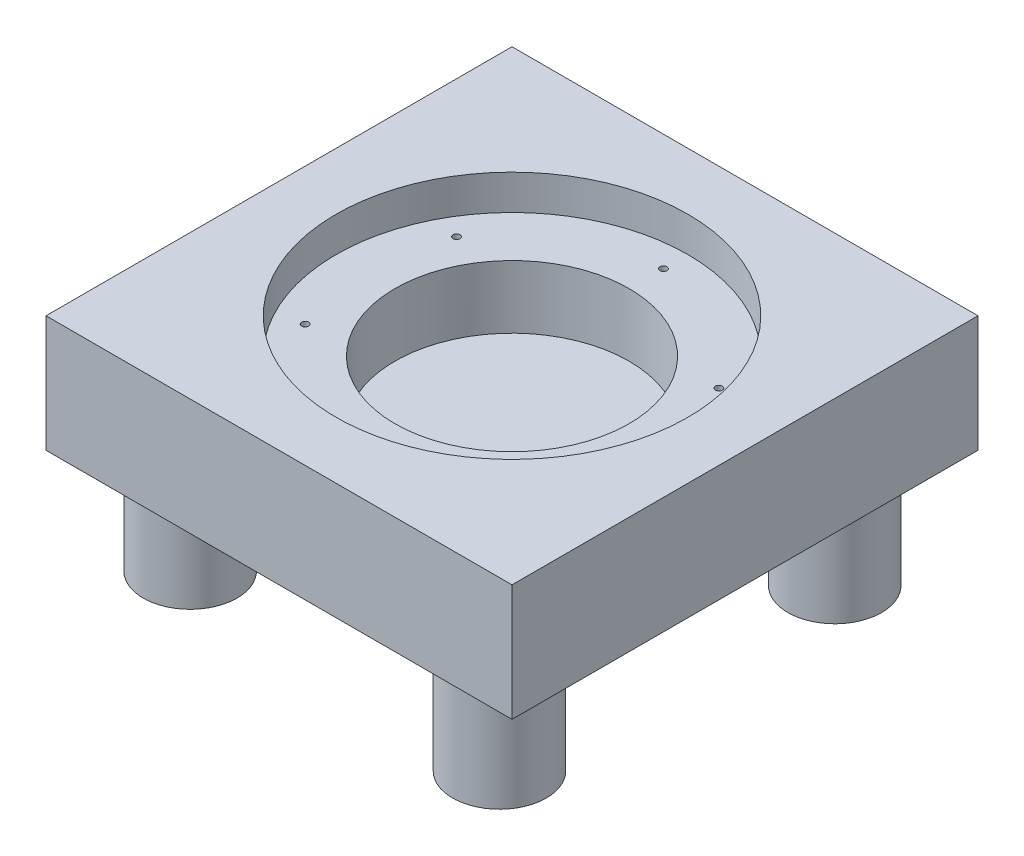
ISO-10303-21;
HEADER;
FILE_DESCRIPTION(('STEP AP214'),'2;1');
FILE_NAME('part.step','',(''),(''),'','','');
FILE_SCHEMA(('AUTOMOTIVE_DESIGN { 1 0 10303 214 1 1 1 1 }'));
ENDSEC;
DATA;
#1=APPLICATION_CONTEXT('core data for automotive mechanical design processes');
#2=APPLICATION_PROTOCOL_DEFINITION('international standard','automotive_design',2000,#1);
#3=PRODUCT_CONTEXT('',#1,'mechanical');
#4=PRODUCT('Part','Part','',(#3));
#5=PRODUCT_RELATED_PRODUCT_CATEGORY('part','',(#4));
#6=PRODUCT_DEFINITION_FORMATION('','',#4);
#7=PRODUCT_DEFINITION_CONTEXT('part definition',#1,'design');
#8=PRODUCT_DEFINITION('design','',#6,#7);
#9=PRODUCT_DEFINITION_SHAPE('','',#8);
#10=(LENGTH_UNIT() NAMED_UNIT(*) SI_UNIT(.MILLI.,.METRE.));
#11=(NAMED_UNIT(*) PLANE_ANGLE_UNIT() SI_UNIT($,.RADIAN.));
#12=(NAMED_UNIT(*) SI_UNIT($,.STERADIAN.) SOLID_ANGLE_UNIT());
#13=UNCERTAINTY_MEASURE_WITH_UNIT(LENGTH_MEASURE(1.E-05),#10,'distance_accuracy_value','');
#14=(GEOMETRIC_REPRESENTATION_CONTEXT(3) GLOBAL_UNCERTAINTY_ASSIGNED_CONTEXT((#13)) GLOBAL_UNIT_ASSIGNED_CONTEXT((#10,
#11,#12)) REPRESENTATION_CONTEXT('',''));
#15=CARTESIAN_POINT('',(0.,0.,0.));
#16=DIRECTION('',(0.,0.,1.));
#17=DIRECTION('',(1.,0.,0.));
#18=AXIS2_PLACEMENT_3D('',#15,#16,#17);
#19=CARTESIAN_POINT('',(0.,0.,0.));
#20=DIRECTION('',(0.,1.,0.));
#21=DIRECTION('',(0.,0.,1.));
#22=AXIS2_PLACEMENT_3D('',#19,#20,#21);
#23=CYLINDRICAL_SURFACE('',#22,50.25);
#24=CARTESIAN_POINT('',(0.,35.,0.));
#25=DIRECTION('',(0.,1.,0.));
#26=DIRECTION('',(0.,0.,1.));
#27=AXIS2_PLACEMENT_3D('',#24,#25,#26);
#28=CIRCLE('',#27,50.25);
#29=CARTESIAN_POINT('',(0.,35.,50.25));
#30=VERTEX_POINT('',#29);
#31=EDGE_CURVE('E124',#30,#30,#28,.T.);
#32=ORIENTED_EDGE('',*,*,#31,.T.);
#33=EDGE_LOOP('',(#32));
#34=FACE_BOUND('',#33,.T.);
#35=CARTESIAN_POINT('',(0.,8.,0.));
#36=DIRECTION('',(0.,-1.,0.));
#37=DIRECTION('',(0.,0.,-1.));
#38=AXIS2_PLACEMENT_3D('',#35,#36,#37);
#39=CIRCLE('',#38,50.25);
#40=CARTESIAN_POINT('',(0.,8.,-50.25));
#41=VERTEX_POINT('',#40);
#42=EDGE_CURVE('E11',#41,#41,#39,.F.);
#43=ORIENTED_EDGE('',*,*,#42,.F.);
#44=EDGE_LOOP('',(#43));
#45=FACE_BOUND('',#44,.T.);
#46=ADVANCED_FACE('F45',(#34,#45),#23,.F.);
#47=CARTESIAN_POINT('',(100.,50.,100.));
#48=DIRECTION('',(-1.,0.,0.));
#49=DIRECTION('',(0.,0.,1.));
#50=AXIS2_PLACEMENT_3D('',#47,#48,#49);
#51=PLANE('',#50);
#52=DIRECTION('',(0.,0.,-1.));
#53=VECTOR('',#52,1.);
#54=CARTESIAN_POINT('',(100.,0.,100.));
#55=LINE('',#54,#53);
#56=CARTESIAN_POINT('',(100.,0.,100.));
#57=VERTEX_POINT('',#56);
#58=CARTESIAN_POINT('',(100.,0.,-100.));
#59=VERTEX_POINT('',#58);
#60=EDGE_CURVE('E112',#57,#59,#55,.T.);
#61=ORIENTED_EDGE('',*,*,#60,.T.);
#62=DIRECTION('',(0.,-1.,0.));
#63=VECTOR('',#62,1.);
#64=CARTESIAN_POINT('',(100.,50.,-100.));
#65=LINE('',#64,#63);
#66=CARTESIAN_POINT('',(100.,50.,-100.));
#67=VERTEX_POINT('',#66);
#68=EDGE_CURVE('E54',#67,#59,#65,.T.);
#69=ORIENTED_EDGE('',*,*,#68,.F.);
#70=DIRECTION('',(0.,0.,-1.));
#71=VECTOR('',#70,1.);
#72=CARTESIAN_POINT('',(100.,50.,100.));
#73=LINE('',#72,#71);
#74=CARTESIAN_POINT('',(100.,50.,100.));
#75=VERTEX_POINT('',#74);
#76=EDGE_CURVE('E98',#75,#67,#73,.T.);
#77=ORIENTED_EDGE('',*,*,#76,.F.);
#78=DIRECTION('',(0.,-1.,0.));
#79=VECTOR('',#78,1.);
#80=CARTESIAN_POINT('',(100.,50.,100.));
#81=LINE('',#80,#79);
#82=EDGE_CURVE('E108',#75,#57,#81,.T.);
#83=ORIENTED_EDGE('',*,*,#82,.T.);
#84=EDGE_LOOP('',(#61,#69,#77,#83));
#85=FACE_BOUND('',#84,.T.);
#86=ADVANCED_FACE('F47',(#85),#51,.F.);
#87=CARTESIAN_POINT('',(-100.,50.,-100.));
#88=DIRECTION('',(0.,0.,1.));
#89=DIRECTION('',(1.,0.,0.));
#90=AXIS2_PLACEMENT_3D('',#87,#88,#89);
#91=PLANE('',#90);
#92=DIRECTION('',(-1.,0.,0.));
#93=VECTOR('',#92,1.);
#94=CARTESIAN_POINT('',(-100.,0.,-100.));
#95=LINE('',#94,#93);
#96=CARTESIAN_POINT('',(-100.,0.,-100.));
#97=VERTEX_POINT('',#96);
#98=EDGE_CURVE('E103',#59,#97,#95,.T.);
#99=ORIENTED_EDGE('',*,*,#98,.T.);
#100=DIRECTION('',(0.,-1.,0.));
#101=VECTOR('',#100,1.);
#102=CARTESIAN_POINT('',(-100.,50.,-100.));
#103=LINE('',#102,#101);
#104=CARTESIAN_POINT('',(-100.,50.,-100.));
#105=VERTEX_POINT('',#104);
#106=EDGE_CURVE('E101',#105,#97,#103,.T.);
#107=ORIENTED_EDGE('',*,*,#106,.F.);
#108=DIRECTION('',(-1.,0.,0.));
#109=VECTOR('',#108,1.);
#110=CARTESIAN_POINT('',(-100.,50.,-100.));
#111=LINE('',#110,#109);
#112=EDGE_CURVE('E93',#67,#105,#111,.T.);
#113=ORIENTED_EDGE('',*,*,#112,.F.);
#114=ORIENTED_EDGE('',*,*,#68,.T.);
#115=EDGE_LOOP('',(#99,#107,#113,#114));
#116=FACE_BOUND('',#115,.T.);
#117=ADVANCED_FACE('F102',(#116),#91,.F.);
#118=CARTESIAN_POINT('',(-100.,50.,100.));
#119=DIRECTION('',(1.,0.,0.));
#120=DIRECTION('',(0.,0.,-1.));
#121=AXIS2_PLACEMENT_3D('',#118,#119,#120);
#122=PLANE('',#121);
#123=DIRECTION('',(0.,0.,1.));
#124=VECTOR('',#123,1.);
#125=CARTESIAN_POINT('',(-100.,0.,100.));
#126=LINE('',#125,#124);
#127=CARTESIAN_POINT('',(-100.,0.,100.));
#128=VERTEX_POINT('',#127);
#129=EDGE_CURVE('E79',#97,#128,#126,.T.);
#130=ORIENTED_EDGE('',*,*,#129,.T.);
#131=DIRECTION('',(0.,-1.,0.));
#132=VECTOR('',#131,1.);
#133=CARTESIAN_POINT('',(-100.,50.,100.));
#134=LINE('',#133,#132);
#135=CARTESIAN_POINT('',(-100.,50.,100.));
#136=VERTEX_POINT('',#135);
#137=EDGE_CURVE('E104',#136,#128,#134,.T.);
#138=ORIENTED_EDGE('',*,*,#137,.F.);
#139=DIRECTION('',(0.,0.,1.));
#140=VECTOR('',#139,1.);
#141=CARTESIAN_POINT('',(-100.,50.,100.));
#142=LINE('',#141,#140);
#143=EDGE_CURVE('E96',#105,#136,#142,.T.);
#144=ORIENTED_EDGE('',*,*,#143,.F.);
#145=ORIENTED_EDGE('',*,*,#106,.T.);
#146=EDGE_LOOP('',(#130,#138,#144,#145));
#147=FACE_BOUND('',#146,.T.);
#148=ADVANCED_FACE('F106',(#147),#122,.F.);
#149=CARTESIAN_POINT('',(-100.,50.,100.));
#150=DIRECTION('',(0.,0.,-1.));
#151=DIRECTION('',(-1.,0.,0.));
#152=AXIS2_PLACEMENT_3D('',#149,#150,#151);
#153=PLANE('',#152);
#154=DIRECTION('',(1.,0.,0.));
#155=VECTOR('',#154,1.);
#156=CARTESIAN_POINT('',(-100.,0.,100.));
#157=LINE('',#156,#155);
#158=EDGE_CURVE('E85',#128,#57,#157,.T.);
#159=ORIENTED_EDGE('',*,*,#158,.T.);
#160=ORIENTED_EDGE('',*,*,#82,.F.);
#161=DIRECTION('',(1.,0.,0.));
#162=VECTOR('',#161,1.);
#163=CARTESIAN_POINT('',(-100.,50.,100.));
#164=LINE('',#163,#162);
#165=EDGE_CURVE('E62',#136,#75,#164,.T.);
#166=ORIENTED_EDGE('',*,*,#165,.F.);
#167=ORIENTED_EDGE('',*,*,#137,.T.);
#168=EDGE_LOOP('',(#159,#160,#166,#167));
#169=FACE_BOUND('',#168,.T.);
#170=ADVANCED_FACE('F224',(#169),#153,.F.);
#171=CARTESIAN_POINT('',(0.,50.,0.));
#172=DIRECTION('',(0.,-1.,0.));
#173=DIRECTION('',(0.,0.,-1.));
#174=AXIS2_PLACEMENT_3D('',#171,#172,#173);
#175=PLANE('',#174);
#176=CARTESIAN_POINT('',(0.,50.,0.));
#177=DIRECTION('',(0.,-1.,0.));
#178=DIRECTION('',(0.,0.,-1.));
#179=AXIS2_PLACEMENT_3D('',#176,#177,#178);
#180=CIRCLE('',#179,75.5);
#181=CARTESIAN_POINT('',(0.,50.,-75.5));
#182=VERTEX_POINT('',#181);
#183=EDGE_CURVE('E115',#182,#182,#180,.F.);
#184=ORIENTED_EDGE('',*,*,#183,.F.);
#185=EDGE_LOOP('',(#184));
#186=FACE_BOUND('',#185,.T.);
#187=ORIENTED_EDGE('',*,*,#76,.T.);
#188=ORIENTED_EDGE('',*,*,#112,.T.);
#189=ORIENTED_EDGE('',*,*,#143,.T.);
#190=ORIENTED_EDGE('',*,*,#165,.T.);
#191=EDGE_LOOP('',(#187,#188,#189,#190));
#192=FACE_BOUND('',#191,.T.);
#193=ADVANCED_FACE('F94',(#186,#192),#175,.F.);
#194=CARTESIAN_POINT('',(0.,0.,0.));
#195=DIRECTION('',(0.,-1.,0.));
#196=DIRECTION('',(0.,0.,-1.));
#197=AXIS2_PLACEMENT_3D('',#194,#195,#196);
#198=PLANE('',#197);
#199=CARTESIAN_POINT('',(66.5129015187802,0.,71.8913379597583));
#200=DIRECTION('',(0.,-1.,0.));
#201=DIRECTION('',(-0.999390827019096,0.,0.0348994967025045));
#202=AXIS2_PLACEMENT_3D('',#199,#200,#201);
#203=CIRCLE('',#202,20.1233206745886);
#204=CARTESIAN_POINT('',(46.4018394274327,0.,72.5936317232845));
#205=VERTEX_POINT('',#204);
#206=EDGE_CURVE('E153',#205,#205,#203,.T.);
#207=ORIENTED_EDGE('',*,*,#206,.F.);
#208=EDGE_LOOP('',(#207));
#209=FACE_BOUND('',#208,.T.);
#210=CARTESIAN_POINT('',(69.5262769118834,0.,-68.9813551683586));
#211=DIRECTION('',(0.,-1.,0.));
#212=DIRECTION('',(0.0697564737441324,0.,0.997564050259824));
#213=AXIS2_PLACEMENT_3D('',#210,#211,#212);
#214=CIRCLE('',#213,20.1233206745886);
#215=CARTESIAN_POINT('',(70.9300088021651,0.,-48.9070538915388));
#216=VERTEX_POINT('',#215);
#217=EDGE_CURVE('E147',#216,#216,#214,.T.);
#218=ORIENTED_EDGE('',*,*,#217,.F.);
#219=EDGE_LOOP('',(#218));
#220=FACE_BOUND('',#219,.T.);
#221=CARTESIAN_POINT('',(-71.3657656624276,0.,-67.0765088052934));
#222=DIRECTION('',(0.,-1.,0.));
#223=DIRECTION('',(0.994521895368272,0.,-0.104528463267664));
#224=AXIS2_PLACEMENT_3D('',#221,#222,#223);
#225=CIRCLE('',#224,20.1233206745886);
#226=CARTESIAN_POINT('',(-51.3526826440322,0.,-69.1799685912505));
#227=VERTEX_POINT('',#226);
#228=EDGE_CURVE('E140',#227,#227,#225,.T.);
#229=ORIENTED_EDGE('',*,*,#228,.F.);
#230=EDGE_LOOP('',(#229));
#231=FACE_BOUND('',#230,.T.);
#232=CARTESIAN_POINT('',(-74.1688104863408,0.,63.9634121442282));
#233=DIRECTION('',(0.,-1.,0.));
#234=DIRECTION('',(0.,0.,-1.));
#235=AXIS2_PLACEMENT_3D('',#232,#233,#234);
#236=CIRCLE('',#235,20.1233206745886);
#237=CARTESIAN_POINT('',(-74.1688104863408,0.,43.8400914696396));
#238=VERTEX_POINT('',#237);
#239=EDGE_CURVE('E132',#238,#238,#236,.T.);
#240=ORIENTED_EDGE('',*,*,#239,.F.);
#241=EDGE_LOOP('',(#240));
#242=FACE_BOUND('',#241,.T.);
#243=ORIENTED_EDGE('',*,*,#60,.F.);
#244=ORIENTED_EDGE('',*,*,#158,.F.);
#245=ORIENTED_EDGE('',*,*,#129,.F.);
#246=ORIENTED_EDGE('',*,*,#98,.F.);
#247=EDGE_LOOP('',(#243,#244,#245,#246));
#248=FACE_BOUND('',#247,.T.);
#249=ADVANCED_FACE('F219',(#209,#220,#231,#242,#248),#198,.T.);
#250=CARTESIAN_POINT('',(0.,50.000012,0.));
#251=DIRECTION('',(0.,-1.,0.));
#252=DIRECTION('',(0.,0.,-1.));
#253=AXIS2_PLACEMENT_3D('',#250,#251,#252);
#254=CYLINDRICAL_SURFACE('',#253,75.5);
#255=CARTESIAN_POINT('',(0.,35.,0.));
#256=DIRECTION('',(0.,1.,0.));
#257=DIRECTION('',(0.,0.,1.));
#258=AXIS2_PLACEMENT_3D('',#255,#256,#257);
#259=CIRCLE('',#258,75.5);
#260=CARTESIAN_POINT('',(0.,35.,-75.5));
#261=VERTEX_POINT('',#260);
#262=EDGE_CURVE('E123',#261,#261,#259,.T.);
#263=CARTESIAN_POINT('',(0.,35.,-75.5));
#264=CARTESIAN_POINT('',(0.,35.15625,-75.5));
#265=CARTESIAN_POINT('',(0.,35.3125,-75.5));
#266=CARTESIAN_POINT('',(0.,35.625,-75.5));
#267=CARTESIAN_POINT('',(0.,35.78125,-75.5));
#268=CARTESIAN_POINT('',(0.,36.09375,-75.5));
#269=CARTESIAN_POINT('',(0.,36.25,-75.5));
#270=CARTESIAN_POINT('',(0.,36.5625,-75.5));
#271=CARTESIAN_POINT('',(0.,36.71875,-75.5));
#272=CARTESIAN_POINT('',(0.,37.03125,-75.5));
#273=CARTESIAN_POINT('',(0.,37.1875,-75.5));
#274=CARTESIAN_POINT('',(0.,37.5,-75.5));
#275=CARTESIAN_POINT('',(0.,37.65625,-75.5));
#276=CARTESIAN_POINT('',(0.,37.96875,-75.5));
#277=CARTESIAN_POINT('',(0.,38.125,-75.5));
#278=CARTESIAN_POINT('',(0.,38.4375,-75.5));
#279=CARTESIAN_POINT('',(0.,38.59375,-75.5));
#280=CARTESIAN_POINT('',(0.,38.90625,-75.5));
#281=CARTESIAN_POINT('',(0.,39.0625,-75.5));
#282=CARTESIAN_POINT('',(0.,39.375,-75.5));
#283=CARTESIAN_POINT('',(0.,39.53125,-75.5));
#284=CARTESIAN_POINT('',(0.,39.84375,-75.5));
#285=CARTESIAN_POINT('',(0.,40.,-75.5));
#286=CARTESIAN_POINT('',(0.,40.3125,-75.5));
#287=CARTESIAN_POINT('',(0.,40.46875,-75.5));
#288=CARTESIAN_POINT('',(0.,40.78125,-75.5));
#289=CARTESIAN_POINT('',(0.,40.9375,-75.5));
#290=CARTESIAN_POINT('',(0.,41.25,-75.5));
#291=CARTESIAN_POINT('',(0.,41.40625,-75.5));
#292=CARTESIAN_POINT('',(0.,41.71875,-75.5));
#293=CARTESIAN_POINT('',(0.,41.875,-75.5));
#294=CARTESIAN_POINT('',(0.,42.1875,-75.5));
#295=CARTESIAN_POINT('',(0.,42.34375,-75.5));
#296=CARTESIAN_POINT('',(0.,42.65625,-75.5));
#297=CARTESIAN_POINT('',(0.,42.8125,-75.5));
#298=CARTESIAN_POINT('',(0.,43.125,-75.5));
#299=CARTESIAN_POINT('',(0.,43.28125,-75.5));
#300=CARTESIAN_POINT('',(0.,43.59375,-75.5));
#301=CARTESIAN_POINT('',(0.,43.75,-75.5));
#302=CARTESIAN_POINT('',(0.,44.0625,-75.5));
#303=CARTESIAN_POINT('',(0.,44.21875,-75.5));
#304=CARTESIAN_POINT('',(0.,44.53125,-75.5));
#305=CARTESIAN_POINT('',(0.,44.6875,-75.5));
#306=CARTESIAN_POINT('',(0.,45.,-75.5));
#307=CARTESIAN_POINT('',(0.,45.15625,-75.5));
#308=CARTESIAN_POINT('',(0.,45.46875,-75.5));
#309=CARTESIAN_POINT('',(0.,45.625,-75.5));
#310=CARTESIAN_POINT('',(0.,45.9375,-75.5));
#311=CARTESIAN_POINT('',(0.,46.09375,-75.5));
#312=CARTESIAN_POINT('',(0.,46.40625,-75.5));
#313=CARTESIAN_POINT('',(0.,46.5625,-75.5));
#314=CARTESIAN_POINT('',(0.,46.875,-75.5));
#315=CARTESIAN_POINT('',(0.,47.03125,-75.5));
#316=CARTESIAN_POINT('',(0.,47.34375,-75.5));
#317=CARTESIAN_POINT('',(0.,47.5,-75.5));
#318=CARTESIAN_POINT('',(0.,47.8125,-75.5));
#319=CARTESIAN_POINT('',(0.,47.96875,-75.5));
#320=CARTESIAN_POINT('',(0.,48.28125,-75.5));
#321=CARTESIAN_POINT('',(0.,48.4375,-75.5));
#322=CARTESIAN_POINT('',(0.,48.75,-75.5));
#323=CARTESIAN_POINT('',(0.,48.90625,-75.5));
#324=CARTESIAN_POINT('',(0.,49.21875,-75.5));
#325=CARTESIAN_POINT('',(0.,49.375,-75.5));
#326=CARTESIAN_POINT('',(0.,49.6875,-75.5));
#327=CARTESIAN_POINT('',(0.,49.84375,-75.5));
#328=CARTESIAN_POINT('',(0.,50.,-75.5));
#329=B_SPLINE_CURVE_WITH_KNOTS('',3,(#263,#264,#265,#266,#267,#268,#269,#270,#271,#272,#273,
#274,#275,#276,#277,#278,#279,#280,#281,#282,#283,#284,#285,#286,#287,#288,#289,#290,#291,#292,
#293,#294,#295,#296,#297,#298,#299,#300,#301,#302,#303,#304,#305,#306,#307,#308,#309,#310,#311,
#312,#313,#314,#315,#316,#317,#318,#319,#320,#321,#322,#323,#324,#325,#326,#327,#328),
.UNSPECIFIED.,.F.,.F.,(4,2,2,2,2,2,2,2,2,2,2,2,2,2,2,2,2,2,2,2,2,2,2,2,2,2,2,2,2,2,2,2,4),(0.,
0.468750000000004,0.937500000000001,1.40625,1.875,2.34375000000001,2.8125,3.28125000000001,3.75,
4.21875000000001,4.6875,5.15625000000001,5.62500000000001,6.09375,6.56250000000001,
7.03125000000001,7.50000000000001,7.96875,8.43750000000001,8.90625,9.37500000000001,
9.84375000000001,10.3125,10.78125,11.25,11.71875,12.1875,12.65625,13.125,13.59375,14.0625,
14.53125,15.),.UNSPECIFIED.);
#330=EDGE_CURVE('BSEAM207',#261,#182,#329,.T.);
#331=ORIENTED_EDGE('',*,*,#262,.F.);
#332=ORIENTED_EDGE('',*,*,#183,.T.);
#333=ORIENTED_EDGE('',*,*,#330,.T.);
#334=ORIENTED_EDGE('',*,*,#330,.F.);
#335=EDGE_LOOP('',(#331,#333,#332,#334));
#336=FACE_BOUND('',#335,.T.);
#337=ADVANCED_FACE('F207',(#336),#254,.F.);
#338=CARTESIAN_POINT('',(0.,35.,0.));
#339=DIRECTION('',(0.,1.,0.));
#340=DIRECTION('',(0.,0.,1.));
#341=AXIS2_PLACEMENT_3D('',#338,#339,#340);
#342=PLANE('',#341);
#343=CARTESIAN_POINT('',(-56.2916512459881,35.,-32.5000000000007));
#344=DIRECTION('',(0.,1.,0.));
#345=DIRECTION('',(0.866025403784433,0.,0.50000000000001));
#346=AXIS2_PLACEMENT_3D('',#343,#344,#345);
#347=CIRCLE('',#346,1.5);
#348=CARTESIAN_POINT('',(-54.9926131403115,35.,-31.7500000000006));
#349=VERTEX_POINT('',#348);
#350=EDGE_CURVE('E170',#349,#349,#347,.T.);
#351=ORIENTED_EDGE('',*,*,#350,.F.);
#352=EDGE_LOOP('',(#351));
#353=FACE_BOUND('',#352,.T.);
#354=CARTESIAN_POINT('',(-56.2916512459888,35.,32.4999999999995));
#355=DIRECTION('',(0.,1.,0.));
#356=DIRECTION('',(0.866025403784443,0.,-0.499999999999992));
#357=AXIS2_PLACEMENT_3D('',#354,#355,#356);
#358=CIRCLE('',#357,1.5);
#359=CARTESIAN_POINT('',(-54.9926131403121,35.,31.7499999999995));
#360=VERTEX_POINT('',#359);
#361=EDGE_CURVE('E176',#360,#360,#358,.T.);
#362=ORIENTED_EDGE('',*,*,#361,.F.);
#363=EDGE_LOOP('',(#362));
#364=FACE_BOUND('',#363,.T.);
#365=CARTESIAN_POINT('',(0.,35.,65.));
#366=DIRECTION('',(0.,1.,0.));
#367=DIRECTION('',(0.,0.,-1.));
#368=AXIS2_PLACEMENT_3D('',#365,#366,#367);
#369=CIRCLE('',#368,1.5);
#370=CARTESIAN_POINT('',(0.,35.,63.5));
#371=VERTEX_POINT('',#370);
#372=EDGE_CURVE('E182',#371,#371,#369,.T.);
#373=ORIENTED_EDGE('',*,*,#372,.F.);
#374=EDGE_LOOP('',(#373));
#375=FACE_BOUND('',#374,.T.);
#376=CARTESIAN_POINT('',(56.2916512459884,35.,32.5000000000003));
#377=DIRECTION('',(0.,1.,0.));
#378=DIRECTION('',(-0.866025403784436,0.,-0.500000000000004));
#379=AXIS2_PLACEMENT_3D('',#376,#377,#378);
#380=CIRCLE('',#379,1.5);
#381=CARTESIAN_POINT('',(54.9926131403117,35.,31.7500000000003));
#382=VERTEX_POINT('',#381);
#383=EDGE_CURVE('E188',#382,#382,#380,.T.);
#384=ORIENTED_EDGE('',*,*,#383,.F.);
#385=EDGE_LOOP('',(#384));
#386=FACE_BOUND('',#385,.T.);
#387=CARTESIAN_POINT('',(56.2916512459886,35.,-32.4999999999999));
#388=DIRECTION('',(0.,1.,0.));
#389=DIRECTION('',(-0.86602540378444,0.,0.499999999999998));
#390=AXIS2_PLACEMENT_3D('',#387,#388,#389);
#391=CIRCLE('',#390,1.5);
#392=CARTESIAN_POINT('',(54.9926131403119,35.,-31.7499999999999));
#393=VERTEX_POINT('',#392);
#394=EDGE_CURVE('E164',#393,#393,#391,.T.);
#395=ORIENTED_EDGE('',*,*,#394,.F.);
#396=EDGE_LOOP('',(#395));
#397=FACE_BOUND('',#396,.T.);
#398=CARTESIAN_POINT('',(0.,35.,-65.));
#399=DIRECTION('',(0.,1.,0.));
#400=DIRECTION('',(0.,0.,1.));
#401=AXIS2_PLACEMENT_3D('',#398,#399,#400);
#402=CIRCLE('',#401,1.5);
#403=CARTESIAN_POINT('',(0.,35.,-63.5));
#404=VERTEX_POINT('',#403);
#405=EDGE_CURVE('E158',#404,#404,#402,.T.);
#406=ORIENTED_EDGE('',*,*,#405,.F.);
#407=EDGE_LOOP('',(#406));
#408=FACE_BOUND('',#407,.T.);
#409=ORIENTED_EDGE('',*,*,#31,.F.);
#410=EDGE_LOOP('',(#409));
#411=FACE_BOUND('',#410,.T.);
#412=ORIENTED_EDGE('',*,*,#262,.T.);
#413=EDGE_LOOP('',(#412));
#414=FACE_BOUND('',#413,.T.);
#415=ADVANCED_FACE('F203',(#353,#364,#375,#386,#397,#408,#411,#414),#342,.T.);
#416=CARTESIAN_POINT('',(-74.1688104863408,-50.,63.9634121442282));
#417=DIRECTION('',(0.,1.,0.));
#418=DIRECTION('',(0.,0.,1.));
#419=AXIS2_PLACEMENT_3D('',#416,#417,#418);
#420=CYLINDRICAL_SURFACE('',#419,20.1233206745886);
#421=CARTESIAN_POINT('',(-74.1688104863408,-50.,63.9634121442282));
#422=DIRECTION('',(0.,-1.,0.));
#423=DIRECTION('',(0.,0.,-1.));
#424=AXIS2_PLACEMENT_3D('',#421,#422,#423);
#425=CIRCLE('',#424,20.1233206745886);
#426=CARTESIAN_POINT('',(-74.1688104863408,-50.,43.8400914696396));
#427=VERTEX_POINT('',#426);
#428=EDGE_CURVE('E126',#427,#427,#425,.T.);
#429=ORIENTED_EDGE('',*,*,#428,.F.);
#430=EDGE_LOOP('',(#429));
#431=FACE_BOUND('',#430,.T.);
#432=ORIENTED_EDGE('',*,*,#239,.T.);
#433=EDGE_LOOP('',(#432));
#434=FACE_BOUND('',#433,.T.);
#435=ADVANCED_FACE('F206',(#431,#434),#420,.T.);
#436=CARTESIAN_POINT('',(-74.1688104863408,-50.,63.9634121442282));
#437=DIRECTION('',(0.,-1.,0.));
#438=DIRECTION('',(0.,0.,-1.));
#439=AXIS2_PLACEMENT_3D('',#436,#437,#438);
#440=PLANE('',#439);
#441=ORIENTED_EDGE('',*,*,#428,.T.);
#442=EDGE_LOOP('',(#441));
#443=FACE_BOUND('',#442,.T.);
#444=ADVANCED_FACE('F244',(#443),#440,.T.);
#445=CARTESIAN_POINT('',(-71.3657656624276,-50.,-67.0765088052934));
#446=DIRECTION('',(0.,1.,0.));
#447=DIRECTION('',(0.,0.,1.));
#448=AXIS2_PLACEMENT_3D('',#445,#446,#447);
#449=CYLINDRICAL_SURFACE('',#448,20.1233206745886);
#450=CARTESIAN_POINT('',(-71.3657656624276,-50.,-67.0765088052934));
#451=DIRECTION('',(0.,-1.,0.));
#452=DIRECTION('',(0.994521895368272,0.,-0.104528463267664));
#453=AXIS2_PLACEMENT_3D('',#450,#451,#452);
#454=CIRCLE('',#453,20.1233206745886);
#455=CARTESIAN_POINT('',(-51.3526826440322,-50.,-69.1799685912505));
#456=VERTEX_POINT('',#455);
#457=EDGE_CURVE('E143',#456,#456,#454,.T.);
#458=ORIENTED_EDGE('',*,*,#457,.F.);
#459=EDGE_LOOP('',(#458));
#460=FACE_BOUND('',#459,.T.);
#461=ORIENTED_EDGE('',*,*,#228,.T.);
#462=EDGE_LOOP('',(#461));
#463=FACE_BOUND('',#462,.T.);
#464=ADVANCED_FACE('F248',(#460,#463),#449,.T.);
#465=CARTESIAN_POINT('',(-71.3657656624276,-50.,-67.0765088052934));
#466=DIRECTION('',(0.,-1.,0.));
#467=DIRECTION('',(0.994521895368272,0.,-0.104528463267664));
#468=AXIS2_PLACEMENT_3D('',#465,#466,#467);
#469=PLANE('',#468);
#470=ORIENTED_EDGE('',*,*,#457,.T.);
#471=EDGE_LOOP('',(#470));
#472=FACE_BOUND('',#471,.T.);
#473=ADVANCED_FACE('F251',(#472),#469,.T.);
#474=CARTESIAN_POINT('',(69.5262769118834,-50.,-68.9813551683586));
#475=DIRECTION('',(0.,1.,0.));
#476=DIRECTION('',(0.,0.,1.));
#477=AXIS2_PLACEMENT_3D('',#474,#475,#476);
#478=CYLINDRICAL_SURFACE('',#477,20.1233206745886);
#479=CARTESIAN_POINT('',(69.5262769118834,-50.,-68.9813551683586));
#480=DIRECTION('',(0.,-1.,0.));
#481=DIRECTION('',(0.0697564737441324,0.,0.997564050259824));
#482=AXIS2_PLACEMENT_3D('',#479,#480,#481);
#483=CIRCLE('',#482,20.1233206745886);
#484=CARTESIAN_POINT('',(70.9300088021651,-50.,-48.9070538915388));
#485=VERTEX_POINT('',#484);
#486=EDGE_CURVE('E150',#485,#485,#483,.T.);
#487=ORIENTED_EDGE('',*,*,#486,.F.);
#488=EDGE_LOOP('',(#487));
#489=FACE_BOUND('',#488,.T.);
#490=ORIENTED_EDGE('',*,*,#217,.T.);
#491=EDGE_LOOP('',(#490));
#492=FACE_BOUND('',#491,.T.);
#493=ADVANCED_FACE('F255',(#489,#492),#478,.T.);
#494=CARTESIAN_POINT('',(69.5262769118834,-50.,-68.9813551683586));
#495=DIRECTION('',(0.,-1.,0.));
#496=DIRECTION('',(0.0697564737441324,0.,0.997564050259824));
#497=AXIS2_PLACEMENT_3D('',#494,#495,#496);
#498=PLANE('',#497);
#499=ORIENTED_EDGE('',*,*,#486,.T.);
#500=EDGE_LOOP('',(#499));
#501=FACE_BOUND('',#500,.T.);
#502=ADVANCED_FACE('F259',(#501),#498,.T.);
#503=CARTESIAN_POINT('',(66.5129015187802,-50.,71.8913379597583));
#504=DIRECTION('',(0.,1.,0.));
#505=DIRECTION('',(0.,0.,1.));
#506=AXIS2_PLACEMENT_3D('',#503,#504,#505);
#507=CYLINDRICAL_SURFACE('',#506,20.1233206745886);
#508=CARTESIAN_POINT('',(66.5129015187802,-50.,71.8913379597583));
#509=DIRECTION('',(0.,-1.,0.));
#510=DIRECTION('',(-0.999390827019096,0.,0.0348994967025045));
#511=AXIS2_PLACEMENT_3D('',#508,#509,#510);
#512=CIRCLE('',#511,20.1233206745886);
#513=CARTESIAN_POINT('',(46.4018394274327,-50.,72.5936317232845));
#514=VERTEX_POINT('',#513);
#515=EDGE_CURVE('E137',#514,#514,#512,.T.);
#516=ORIENTED_EDGE('',*,*,#515,.F.);
#517=EDGE_LOOP('',(#516));
#518=FACE_BOUND('',#517,.T.);
#519=ORIENTED_EDGE('',*,*,#206,.T.);
#520=EDGE_LOOP('',(#519));
#521=FACE_BOUND('',#520,.T.);
#522=ADVANCED_FACE('F263',(#518,#521),#507,.T.);
#523=CARTESIAN_POINT('',(66.5129015187802,-50.,71.8913379597583));
#524=DIRECTION('',(0.,-1.,0.));
#525=DIRECTION('',(-0.999390827019096,0.,0.0348994967025045));
#526=AXIS2_PLACEMENT_3D('',#523,#524,#525);
#527=PLANE('',#526);
#528=ORIENTED_EDGE('',*,*,#515,.T.);
#529=EDGE_LOOP('',(#528));
#530=FACE_BOUND('',#529,.T.);
#531=ADVANCED_FACE('F267',(#530),#527,.T.);
#532=CARTESIAN_POINT('',(0.,25.,-65.));
#533=DIRECTION('',(0.,1.,0.));
#534=DIRECTION('',(0.,0.,1.));
#535=AXIS2_PLACEMENT_3D('',#532,#533,#534);
#536=CYLINDRICAL_SURFACE('',#535,1.5);
#537=CARTESIAN_POINT('',(0.,25.,-65.));
#538=DIRECTION('',(0.,1.,0.));
#539=DIRECTION('',(0.,0.,1.));
#540=AXIS2_PLACEMENT_3D('',#537,#538,#539);
#541=CIRCLE('',#540,1.5);
#542=CARTESIAN_POINT('',(0.,25.,-63.5));
#543=VERTEX_POINT('',#542);
#544=EDGE_CURVE('E144',#543,#543,#541,.T.);
#545=ORIENTED_EDGE('',*,*,#544,.F.);
#546=EDGE_LOOP('',(#545));
#547=FACE_BOUND('',#546,.T.);
#548=ORIENTED_EDGE('',*,*,#405,.T.);
#549=EDGE_LOOP('',(#548));
#550=FACE_BOUND('',#549,.T.);
#551=ADVANCED_FACE('F271',(#547,#550),#536,.F.);
#552=CARTESIAN_POINT('',(0.,25.,-65.));
#553=DIRECTION('',(0.,1.,0.));
#554=DIRECTION('',(0.,0.,1.));
#555=AXIS2_PLACEMENT_3D('',#552,#553,#554);
#556=PLANE('',#555);
#557=ORIENTED_EDGE('',*,*,#544,.T.);
#558=EDGE_LOOP('',(#557));
#559=FACE_BOUND('',#558,.T.);
#560=ADVANCED_FACE('F275',(#559),#556,.T.);
#561=CARTESIAN_POINT('',(56.2916512459886,25.,-32.4999999999999));
#562=DIRECTION('',(0.,1.,0.));
#563=DIRECTION('',(0.,0.,1.));
#564=AXIS2_PLACEMENT_3D('',#561,#562,#563);
#565=CYLINDRICAL_SURFACE('',#564,1.5);
#566=CARTESIAN_POINT('',(56.2916512459886,25.,-32.4999999999999));
#567=DIRECTION('',(0.,1.,0.));
#568=DIRECTION('',(-0.86602540378444,0.,0.499999999999998));
#569=AXIS2_PLACEMENT_3D('',#566,#567,#568);
#570=CIRCLE('',#569,1.5);
#571=CARTESIAN_POINT('',(54.9926131403119,25.,-31.7499999999999));
#572=VERTEX_POINT('',#571);
#573=EDGE_CURVE('E161',#572,#572,#570,.T.);
#574=ORIENTED_EDGE('',*,*,#573,.F.);
#575=EDGE_LOOP('',(#574));
#576=FACE_BOUND('',#575,.T.);
#577=ORIENTED_EDGE('',*,*,#394,.T.);
#578=EDGE_LOOP('',(#577));
#579=FACE_BOUND('',#578,.T.);
#580=ADVANCED_FACE('F279',(#576,#579),#565,.F.);
#581=CARTESIAN_POINT('',(56.2916512459886,25.,-32.4999999999999));
#582=DIRECTION('',(0.,1.,0.));
#583=DIRECTION('',(-0.86602540378444,0.,0.499999999999998));
#584=AXIS2_PLACEMENT_3D('',#581,#582,#583);
#585=PLANE('',#584);
#586=ORIENTED_EDGE('',*,*,#573,.T.);
#587=EDGE_LOOP('',(#586));
#588=FACE_BOUND('',#587,.T.);
#589=ADVANCED_FACE('F199',(#588),#585,.T.);
#590=CARTESIAN_POINT('',(56.2916512459884,25.,32.5000000000003));
#591=DIRECTION('',(0.,1.,0.));
#592=DIRECTION('',(0.,0.,1.));
#593=AXIS2_PLACEMENT_3D('',#590,#591,#592);
#594=CYLINDRICAL_SURFACE('',#593,1.5);
#595=CARTESIAN_POINT('',(56.2916512459884,25.,32.5000000000003));
#596=DIRECTION('',(0.,1.,0.));
#597=DIRECTION('',(-0.866025403784436,0.,-0.500000000000004));
#598=AXIS2_PLACEMENT_3D('',#595,#596,#597);
#599=CIRCLE('',#598,1.5);
#600=CARTESIAN_POINT('',(54.9926131403117,25.,31.7500000000003));
#601=VERTEX_POINT('',#600);
#602=EDGE_CURVE('E167',#601,#601,#599,.T.);
#603=ORIENTED_EDGE('',*,*,#602,.F.);
#604=EDGE_LOOP('',(#603));
#605=FACE_BOUND('',#604,.T.);
#606=ORIENTED_EDGE('',*,*,#383,.T.);
#607=EDGE_LOOP('',(#606));
#608=FACE_BOUND('',#607,.T.);
#609=ADVANCED_FACE('F196',(#605,#608),#594,.F.);
#610=CARTESIAN_POINT('',(56.2916512459884,25.,32.5000000000003));
#611=DIRECTION('',(0.,1.,0.));
#612=DIRECTION('',(-0.866025403784436,0.,-0.500000000000004));
#613=AXIS2_PLACEMENT_3D('',#610,#611,#612);
#614=PLANE('',#613);
#615=ORIENTED_EDGE('',*,*,#602,.T.);
#616=EDGE_LOOP('',(#615));
#617=FACE_BOUND('',#616,.T.);
#618=ADVANCED_FACE('F194',(#617),#614,.T.);
#619=CARTESIAN_POINT('',(0.,25.,65.));
#620=DIRECTION('',(0.,1.,0.));
#621=DIRECTION('',(0.,0.,1.));
#622=AXIS2_PLACEMENT_3D('',#619,#620,#621);
#623=CYLINDRICAL_SURFACE('',#622,1.5);
#624=CARTESIAN_POINT('',(0.,25.,65.));
#625=DIRECTION('',(0.,1.,0.));
#626=DIRECTION('',(0.,0.,-1.));
#627=AXIS2_PLACEMENT_3D('',#624,#625,#626);
#628=CIRCLE('',#627,1.5);
#629=CARTESIAN_POINT('',(0.,25.,63.5));
#630=VERTEX_POINT('',#629);
#631=EDGE_CURVE('E185',#630,#630,#628,.T.);
#632=ORIENTED_EDGE('',*,*,#631,.F.);
#633=EDGE_LOOP('',(#632));
#634=FACE_BOUND('',#633,.T.);
#635=ORIENTED_EDGE('',*,*,#372,.T.);
#636=EDGE_LOOP('',(#635));
#637=FACE_BOUND('',#636,.T.);
#638=ADVANCED_FACE('F304',(#634,#637),#623,.F.);
#639=CARTESIAN_POINT('',(0.,25.,65.));
#640=DIRECTION('',(0.,1.,0.));
#641=DIRECTION('',(0.,0.,-1.));
#642=AXIS2_PLACEMENT_3D('',#639,#640,#641);
#643=PLANE('',#642);
#644=ORIENTED_EDGE('',*,*,#631,.T.);
#645=EDGE_LOOP('',(#644));
#646=FACE_BOUND('',#645,.T.);
#647=ADVANCED_FACE('F299',(#646),#643,.T.);
#648=CARTESIAN_POINT('',(-56.2916512459888,25.,32.4999999999995));
#649=DIRECTION('',(0.,1.,0.));
#650=DIRECTION('',(0.,0.,1.));
#651=AXIS2_PLACEMENT_3D('',#648,#649,#650);
#652=CYLINDRICAL_SURFACE('',#651,1.5);
#653=CARTESIAN_POINT('',(-56.2916512459888,25.,32.4999999999995));
#654=DIRECTION('',(0.,1.,0.));
#655=DIRECTION('',(0.866025403784443,0.,-0.499999999999992));
#656=AXIS2_PLACEMENT_3D('',#653,#654,#655);
#657=CIRCLE('',#656,1.5);
#658=CARTESIAN_POINT('',(-54.9926131403121,25.,31.7499999999995));
#659=VERTEX_POINT('',#658);
#660=EDGE_CURVE('E179',#659,#659,#657,.T.);
#661=ORIENTED_EDGE('',*,*,#660,.F.);
#662=EDGE_LOOP('',(#661));
#663=FACE_BOUND('',#662,.T.);
#664=ORIENTED_EDGE('',*,*,#361,.T.);
#665=EDGE_LOOP('',(#664));
#666=FACE_BOUND('',#665,.T.);
#667=ADVANCED_FACE('F296',(#663,#666),#652,.F.);
#668=CARTESIAN_POINT('',(-56.2916512459888,25.,32.4999999999995));
#669=DIRECTION('',(0.,1.,0.));
#670=DIRECTION('',(0.866025403784443,0.,-0.499999999999992));
#671=AXIS2_PLACEMENT_3D('',#668,#669,#670);
#672=PLANE('',#671);
#673=ORIENTED_EDGE('',*,*,#660,.T.);
#674=EDGE_LOOP('',(#673));
#675=FACE_BOUND('',#674,.T.);
#676=ADVANCED_FACE('F291',(#675),#672,.T.);
#677=CARTESIAN_POINT('',(-56.2916512459881,25.,-32.5000000000007));
#678=DIRECTION('',(0.,1.,0.));
#679=DIRECTION('',(0.,0.,1.));
#680=AXIS2_PLACEMENT_3D('',#677,#678,#679);
#681=CYLINDRICAL_SURFACE('',#680,1.5);
#682=CARTESIAN_POINT('',(-56.2916512459881,25.,-32.5000000000007));
#683=DIRECTION('',(0.,1.,0.));
#684=DIRECTION('',(0.866025403784433,0.,0.50000000000001));
#685=AXIS2_PLACEMENT_3D('',#682,#683,#684);
#686=CIRCLE('',#685,1.5);
#687=CARTESIAN_POINT('',(-54.9926131403115,25.,-31.7500000000006));
#688=VERTEX_POINT('',#687);
#689=EDGE_CURVE('E173',#688,#688,#686,.T.);
#690=ORIENTED_EDGE('',*,*,#689,.F.);
#691=EDGE_LOOP('',(#690));
#692=FACE_BOUND('',#691,.T.);
#693=ORIENTED_EDGE('',*,*,#350,.T.);
#694=EDGE_LOOP('',(#693));
#695=FACE_BOUND('',#694,.T.);
#696=ADVANCED_FACE('F287',(#692,#695),#681,.F.);
#697=CARTESIAN_POINT('',(-56.2916512459881,25.,-32.5000000000007));
#698=DIRECTION('',(0.,1.,0.));
#699=DIRECTION('',(0.866025403784433,0.,0.50000000000001));
#700=AXIS2_PLACEMENT_3D('',#697,#698,#699);
#701=PLANE('',#700);
#702=ORIENTED_EDGE('',*,*,#689,.T.);
#703=EDGE_LOOP('',(#702));
#704=FACE_BOUND('',#703,.T.);
#705=ADVANCED_FACE('F290',(#704),#701,.T.);
#706=CARTESIAN_POINT('',(0.,8.,0.));
#707=DIRECTION('',(0.,-1.,0.));
#708=DIRECTION('',(0.,0.,-1.));
#709=AXIS2_PLACEMENT_3D('',#706,#707,#708);
#710=PLANE('',#709);
#711=ORIENTED_EDGE('',*,*,#42,.T.);
#712=EDGE_LOOP('',(#711));
#713=FACE_BOUND('',#712,.T.);
#714=ADVANCED_FACE('F294',(#713),#710,.F.);
#715=CLOSED_SHELL('',(#46,#86,#117,#148,#170,#193,#249,#337,#415,#435,#444,#464,#473,#493,#502,
#522,#531,#551,#560,#580,#589,#609,#618,#638,#647,#667,#676,#696,#705,#714));
#716=MANIFOLD_SOLID_BREP('B2',#715);
#717=ADVANCED_BREP_SHAPE_REPRESENTATION('',(#18,#716),#14);
#718=SHAPE_DEFINITION_REPRESENTATION(#9,#717);
ENDSEC;
END-ISO-10303-21;
